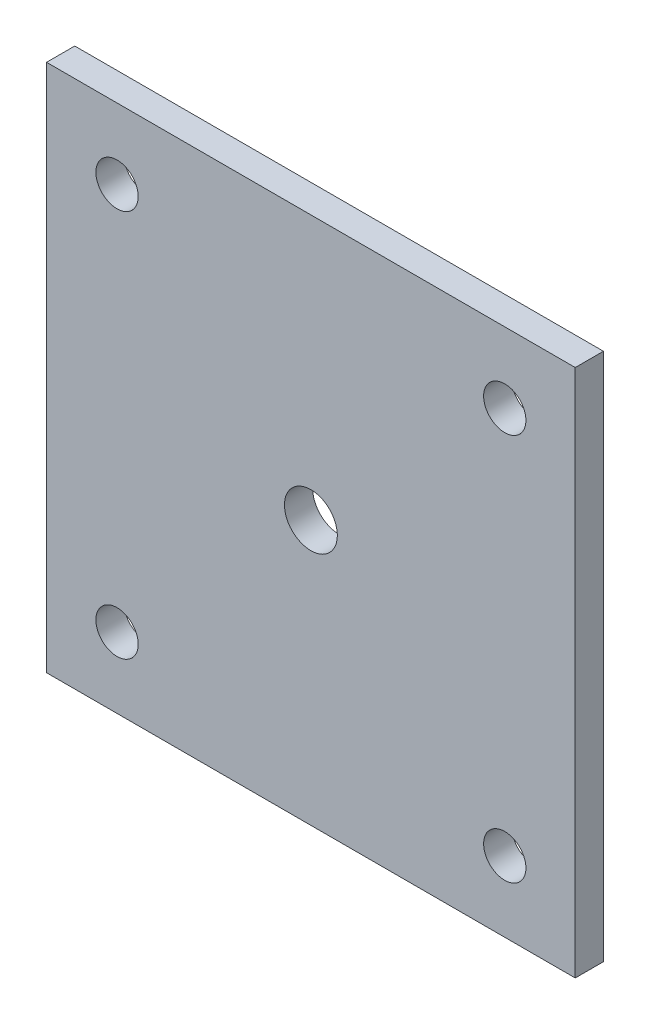
ISO-10303-21;
HEADER;
FILE_DESCRIPTION(('STEP AP214'),'2;1');
FILE_NAME('part.step','',(''),(''),'','','');
FILE_SCHEMA(('AUTOMOTIVE_DESIGN { 1 0 10303 214 1 1 1 1 }'));
ENDSEC;
DATA;
#1=APPLICATION_CONTEXT('core data for automotive mechanical design processes');
#2=APPLICATION_PROTOCOL_DEFINITION('international standard','automotive_design',2000,#1);
#3=PRODUCT_CONTEXT('',#1,'mechanical');
#4=PRODUCT('Part','Part','',(#3));
#5=PRODUCT_RELATED_PRODUCT_CATEGORY('part','',(#4));
#6=PRODUCT_DEFINITION_FORMATION('','',#4);
#7=PRODUCT_DEFINITION_CONTEXT('part definition',#1,'design');
#8=PRODUCT_DEFINITION('design','',#6,#7);
#9=PRODUCT_DEFINITION_SHAPE('','',#8);
#10=(LENGTH_UNIT() NAMED_UNIT(*) SI_UNIT(.MILLI.,.METRE.));
#11=(NAMED_UNIT(*) PLANE_ANGLE_UNIT() SI_UNIT($,.RADIAN.));
#12=(NAMED_UNIT(*) SI_UNIT($,.STERADIAN.) SOLID_ANGLE_UNIT());
#13=UNCERTAINTY_MEASURE_WITH_UNIT(LENGTH_MEASURE(1.E-05),#10,'distance_accuracy_value','');
#14=(GEOMETRIC_REPRESENTATION_CONTEXT(3) GLOBAL_UNCERTAINTY_ASSIGNED_CONTEXT((#13)) GLOBAL_UNIT_ASSIGNED_CONTEXT((#10,
#11,#12)) REPRESENTATION_CONTEXT('',''));
#15=CARTESIAN_POINT('',(0.,0.,0.));
#16=DIRECTION('',(0.,0.,1.));
#17=DIRECTION('',(1.,0.,0.));
#18=AXIS2_PLACEMENT_3D('',#15,#16,#17);
#19=CARTESIAN_POINT('',(75.,75.,8.));
#20=DIRECTION('',(0.,-1.,0.));
#21=DIRECTION('',(0.,0.,-1.));
#22=AXIS2_PLACEMENT_3D('',#19,#20,#21);
#23=PLANE('',#22);
#24=DIRECTION('',(-1.,0.,0.));
#25=VECTOR('',#24,1.);
#26=CARTESIAN_POINT('',(75.,75.,0.));
#27=LINE('',#26,#25);
#28=CARTESIAN_POINT('',(75.,75.,0.));
#29=VERTEX_POINT('',#28);
#30=CARTESIAN_POINT('',(-75.,75.,0.));
#31=VERTEX_POINT('',#30);
#32=EDGE_CURVE('E105',#29,#31,#27,.T.);
#33=ORIENTED_EDGE('',*,*,#32,.T.);
#34=DIRECTION('',(0.,0.,-1.));
#35=VECTOR('',#34,1.);
#36=CARTESIAN_POINT('',(-75.,75.,8.));
#37=LINE('',#36,#35);
#38=CARTESIAN_POINT('',(-75.,75.,8.));
#39=VERTEX_POINT('',#38);
#40=EDGE_CURVE('E11',#39,#31,#37,.T.);
#41=ORIENTED_EDGE('',*,*,#40,.F.);
#42=DIRECTION('',(-1.,0.,0.));
#43=VECTOR('',#42,1.);
#44=CARTESIAN_POINT('',(75.,75.,8.));
#45=LINE('',#44,#43);
#46=CARTESIAN_POINT('',(75.,75.,8.));
#47=VERTEX_POINT('',#46);
#48=EDGE_CURVE('E89',#47,#39,#45,.T.);
#49=ORIENTED_EDGE('',*,*,#48,.F.);
#50=DIRECTION('',(0.,0.,-1.));
#51=VECTOR('',#50,1.);
#52=CARTESIAN_POINT('',(75.,75.,8.));
#53=LINE('',#52,#51);
#54=EDGE_CURVE('E98',#47,#29,#53,.T.);
#55=ORIENTED_EDGE('',*,*,#54,.T.);
#56=EDGE_LOOP('',(#33,#41,#49,#55));
#57=FACE_BOUND('',#56,.T.);
#58=ADVANCED_FACE('F39',(#57),#23,.F.);
#59=CARTESIAN_POINT('',(-75.,-75.,8.));
#60=DIRECTION('',(1.,0.,0.));
#61=DIRECTION('',(0.,0.,-1.));
#62=AXIS2_PLACEMENT_3D('',#59,#60,#61);
#63=PLANE('',#62);
#64=DIRECTION('',(0.,-1.,0.));
#65=VECTOR('',#64,1.);
#66=CARTESIAN_POINT('',(-75.,-75.,0.));
#67=LINE('',#66,#65);
#68=CARTESIAN_POINT('',(-75.,-75.,0.));
#69=VERTEX_POINT('',#68);
#70=EDGE_CURVE('E94',#31,#69,#67,.T.);
#71=ORIENTED_EDGE('',*,*,#70,.T.);
#72=DIRECTION('',(0.,0.,-1.));
#73=VECTOR('',#72,1.);
#74=CARTESIAN_POINT('',(-75.,-75.,8.));
#75=LINE('',#74,#73);
#76=CARTESIAN_POINT('',(-75.,-75.,8.));
#77=VERTEX_POINT('',#76);
#78=EDGE_CURVE('E50',#77,#69,#75,.T.);
#79=ORIENTED_EDGE('',*,*,#78,.F.);
#80=DIRECTION('',(0.,-1.,0.));
#81=VECTOR('',#80,1.);
#82=CARTESIAN_POINT('',(-75.,-75.,8.));
#83=LINE('',#82,#81);
#84=EDGE_CURVE('E81',#39,#77,#83,.T.);
#85=ORIENTED_EDGE('',*,*,#84,.F.);
#86=ORIENTED_EDGE('',*,*,#40,.T.);
#87=EDGE_LOOP('',(#71,#79,#85,#86));
#88=FACE_BOUND('',#87,.T.);
#89=ADVANCED_FACE('F91',(#88),#63,.F.);
#90=CARTESIAN_POINT('',(75.,-75.,8.));
#91=DIRECTION('',(0.,1.,0.));
#92=DIRECTION('',(0.,0.,1.));
#93=AXIS2_PLACEMENT_3D('',#90,#91,#92);
#94=PLANE('',#93);
#95=DIRECTION('',(1.,0.,0.));
#96=VECTOR('',#95,1.);
#97=CARTESIAN_POINT('',(75.,-75.,0.));
#98=LINE('',#97,#96);
#99=CARTESIAN_POINT('',(75.,-75.,0.));
#100=VERTEX_POINT('',#99);
#101=EDGE_CURVE('E75',#69,#100,#98,.T.);
#102=ORIENTED_EDGE('',*,*,#101,.T.);
#103=DIRECTION('',(0.,0.,-1.));
#104=VECTOR('',#103,1.);
#105=CARTESIAN_POINT('',(75.,-75.,8.));
#106=LINE('',#105,#104);
#107=CARTESIAN_POINT('',(75.,-75.,8.));
#108=VERTEX_POINT('',#107);
#109=EDGE_CURVE('E92',#108,#100,#106,.T.);
#110=ORIENTED_EDGE('',*,*,#109,.F.);
#111=DIRECTION('',(1.,0.,0.));
#112=VECTOR('',#111,1.);
#113=CARTESIAN_POINT('',(75.,-75.,8.));
#114=LINE('',#113,#112);
#115=EDGE_CURVE('E86',#77,#108,#114,.T.);
#116=ORIENTED_EDGE('',*,*,#115,.F.);
#117=ORIENTED_EDGE('',*,*,#78,.T.);
#118=EDGE_LOOP('',(#102,#110,#116,#117));
#119=FACE_BOUND('',#118,.T.);
#120=ADVANCED_FACE('F96',(#119),#94,.F.);
#121=CARTESIAN_POINT('',(75.,-75.,8.));
#122=DIRECTION('',(-1.,0.,0.));
#123=DIRECTION('',(0.,0.,1.));
#124=AXIS2_PLACEMENT_3D('',#121,#122,#123);
#125=PLANE('',#124);
#126=DIRECTION('',(0.,1.,0.));
#127=VECTOR('',#126,1.);
#128=CARTESIAN_POINT('',(75.,-75.,0.));
#129=LINE('',#128,#127);
#130=EDGE_CURVE('E79',#100,#29,#129,.T.);
#131=ORIENTED_EDGE('',*,*,#130,.T.);
#132=ORIENTED_EDGE('',*,*,#54,.F.);
#133=DIRECTION('',(0.,1.,0.));
#134=VECTOR('',#133,1.);
#135=CARTESIAN_POINT('',(75.,-75.,8.));
#136=LINE('',#135,#134);
#137=EDGE_CURVE('E54',#108,#47,#136,.T.);
#138=ORIENTED_EDGE('',*,*,#137,.F.);
#139=ORIENTED_EDGE('',*,*,#109,.T.);
#140=EDGE_LOOP('',(#131,#132,#138,#139));
#141=FACE_BOUND('',#140,.T.);
#142=ADVANCED_FACE('F109',(#141),#125,.F.);
#143=CARTESIAN_POINT('',(0.,0.,8.));
#144=DIRECTION('',(0.,0.,-1.));
#145=DIRECTION('',(-1.,0.,0.));
#146=AXIS2_PLACEMENT_3D('',#143,#144,#145);
#147=PLANE('',#146);
#148=CARTESIAN_POINT('',(0.,0.,8.));
#149=DIRECTION('',(0.,0.,1.));
#150=DIRECTION('',(1.,0.,0.));
#151=AXIS2_PLACEMENT_3D('',#148,#149,#150);
#152=CIRCLE('',#151,7.5);
#153=CARTESIAN_POINT('',(7.5,0.,8.));
#154=VERTEX_POINT('',#153);
#155=EDGE_CURVE('E140',#154,#154,#152,.T.);
#156=ORIENTED_EDGE('',*,*,#155,.F.);
#157=EDGE_LOOP('',(#156));
#158=FACE_BOUND('',#157,.T.);
#159=CARTESIAN_POINT('',(-55.,55.,8.));
#160=DIRECTION('',(0.,0.,1.));
#161=DIRECTION('',(1.,0.,0.));
#162=AXIS2_PLACEMENT_3D('',#159,#160,#161);
#163=CIRCLE('',#162,6.);
#164=CARTESIAN_POINT('',(-49.,55.,8.));
#165=VERTEX_POINT('',#164);
#166=EDGE_CURVE('E129',#165,#165,#163,.T.);
#167=ORIENTED_EDGE('',*,*,#166,.F.);
#168=EDGE_LOOP('',(#167));
#169=FACE_BOUND('',#168,.T.);
#170=CARTESIAN_POINT('',(55.,-55.,8.));
#171=DIRECTION('',(0.,0.,1.));
#172=DIRECTION('',(1.,0.,0.));
#173=AXIS2_PLACEMENT_3D('',#170,#171,#172);
#174=CIRCLE('',#173,6.);
#175=CARTESIAN_POINT('',(61.,-55.,8.));
#176=VERTEX_POINT('',#175);
#177=EDGE_CURVE('E125',#176,#176,#174,.T.);
#178=ORIENTED_EDGE('',*,*,#177,.F.);
#179=EDGE_LOOP('',(#178));
#180=FACE_BOUND('',#179,.T.);
#181=CARTESIAN_POINT('',(55.,55.,8.));
#182=DIRECTION('',(0.,0.,1.));
#183=DIRECTION('',(1.,0.,0.));
#184=AXIS2_PLACEMENT_3D('',#181,#182,#183);
#185=CIRCLE('',#184,6.);
#186=CARTESIAN_POINT('',(61.,55.,8.));
#187=VERTEX_POINT('',#186);
#188=EDGE_CURVE('E131',#187,#187,#185,.T.);
#189=ORIENTED_EDGE('',*,*,#188,.F.);
#190=EDGE_LOOP('',(#189));
#191=FACE_BOUND('',#190,.T.);
#192=CARTESIAN_POINT('',(-55.,-55.,8.));
#193=DIRECTION('',(0.,0.,1.));
#194=DIRECTION('',(1.,0.,0.));
#195=AXIS2_PLACEMENT_3D('',#192,#193,#194);
#196=CIRCLE('',#195,6.);
#197=CARTESIAN_POINT('',(-49.,-55.,8.));
#198=VERTEX_POINT('',#197);
#199=EDGE_CURVE('E104',#198,#198,#196,.T.);
#200=ORIENTED_EDGE('',*,*,#199,.F.);
#201=EDGE_LOOP('',(#200));
#202=FACE_BOUND('',#201,.T.);
#203=ORIENTED_EDGE('',*,*,#48,.T.);
#204=ORIENTED_EDGE('',*,*,#84,.T.);
#205=ORIENTED_EDGE('',*,*,#115,.T.);
#206=ORIENTED_EDGE('',*,*,#137,.T.);
#207=EDGE_LOOP('',(#203,#204,#205,#206));
#208=FACE_BOUND('',#207,.T.);
#209=ADVANCED_FACE('F88',(#158,#169,#180,#191,#202,#208),#147,.F.);
#210=CARTESIAN_POINT('',(0.,0.,0.));
#211=DIRECTION('',(0.,0.,-1.));
#212=DIRECTION('',(-1.,0.,0.));
#213=AXIS2_PLACEMENT_3D('',#210,#211,#212);
#214=PLANE('',#213);
#215=CARTESIAN_POINT('',(0.,0.,0.));
#216=DIRECTION('',(0.,0.,1.));
#217=DIRECTION('',(1.,0.,0.));
#218=AXIS2_PLACEMENT_3D('',#215,#216,#217);
#219=CIRCLE('',#218,7.5);
#220=CARTESIAN_POINT('',(7.5,0.,0.));
#221=VERTEX_POINT('',#220);
#222=EDGE_CURVE('E136',#221,#221,#219,.T.);
#223=ORIENTED_EDGE('',*,*,#222,.T.);
#224=EDGE_LOOP('',(#223));
#225=FACE_BOUND('',#224,.T.);
#226=CARTESIAN_POINT('',(-55.,55.,0.));
#227=DIRECTION('',(0.,0.,1.));
#228=DIRECTION('',(1.,0.,0.));
#229=AXIS2_PLACEMENT_3D('',#226,#227,#228);
#230=CIRCLE('',#229,6.);
#231=CARTESIAN_POINT('',(-49.,55.,0.));
#232=VERTEX_POINT('',#231);
#233=EDGE_CURVE('E116',#232,#232,#230,.T.);
#234=ORIENTED_EDGE('',*,*,#233,.T.);
#235=EDGE_LOOP('',(#234));
#236=FACE_BOUND('',#235,.T.);
#237=CARTESIAN_POINT('',(55.,-55.,0.));
#238=DIRECTION('',(0.,0.,1.));
#239=DIRECTION('',(1.,0.,0.));
#240=AXIS2_PLACEMENT_3D('',#237,#238,#239);
#241=CIRCLE('',#240,6.);
#242=CARTESIAN_POINT('',(61.,-55.,0.));
#243=VERTEX_POINT('',#242);
#244=EDGE_CURVE('E121',#243,#243,#241,.T.);
#245=ORIENTED_EDGE('',*,*,#244,.T.);
#246=EDGE_LOOP('',(#245));
#247=FACE_BOUND('',#246,.T.);
#248=CARTESIAN_POINT('',(55.,55.,0.));
#249=DIRECTION('',(0.,0.,1.));
#250=DIRECTION('',(1.,0.,0.));
#251=AXIS2_PLACEMENT_3D('',#248,#249,#250);
#252=CIRCLE('',#251,6.);
#253=CARTESIAN_POINT('',(61.,55.,0.));
#254=VERTEX_POINT('',#253);
#255=EDGE_CURVE('E127',#254,#254,#252,.T.);
#256=ORIENTED_EDGE('',*,*,#255,.T.);
#257=EDGE_LOOP('',(#256));
#258=FACE_BOUND('',#257,.T.);
#259=CARTESIAN_POINT('',(-55.,-55.,0.));
#260=DIRECTION('',(0.,0.,1.));
#261=DIRECTION('',(1.,0.,0.));
#262=AXIS2_PLACEMENT_3D('',#259,#260,#261);
#263=CIRCLE('',#262,6.);
#264=CARTESIAN_POINT('',(-49.,-55.,0.));
#265=VERTEX_POINT('',#264);
#266=EDGE_CURVE('E117',#265,#265,#263,.T.);
#267=ORIENTED_EDGE('',*,*,#266,.T.);
#268=EDGE_LOOP('',(#267));
#269=FACE_BOUND('',#268,.T.);
#270=ORIENTED_EDGE('',*,*,#32,.F.);
#271=ORIENTED_EDGE('',*,*,#130,.F.);
#272=ORIENTED_EDGE('',*,*,#101,.F.);
#273=ORIENTED_EDGE('',*,*,#70,.F.);
#274=EDGE_LOOP('',(#270,#271,#272,#273));
#275=FACE_BOUND('',#274,.T.);
#276=ADVANCED_FACE('F114',(#225,#236,#247,#258,#269,#275),#214,.T.);
#277=CARTESIAN_POINT('',(-55.,-55.,8.));
#278=DIRECTION('',(0.,0.,-1.));
#279=DIRECTION('',(-1.,0.,0.));
#280=AXIS2_PLACEMENT_3D('',#277,#278,#279);
#281=CYLINDRICAL_SURFACE('',#280,6.);
#282=ORIENTED_EDGE('',*,*,#199,.T.);
#283=EDGE_LOOP('',(#282));
#284=FACE_BOUND('',#283,.T.);
#285=ORIENTED_EDGE('',*,*,#266,.F.);
#286=EDGE_LOOP('',(#285));
#287=FACE_BOUND('',#286,.T.);
#288=ADVANCED_FACE('F159',(#284,#287),#281,.F.);
#289=CARTESIAN_POINT('',(55.,55.,8.));
#290=DIRECTION('',(0.,0.,-1.));
#291=DIRECTION('',(-1.,0.,0.));
#292=AXIS2_PLACEMENT_3D('',#289,#290,#291);
#293=CYLINDRICAL_SURFACE('',#292,6.);
#294=ORIENTED_EDGE('',*,*,#188,.T.);
#295=EDGE_LOOP('',(#294));
#296=FACE_BOUND('',#295,.T.);
#297=ORIENTED_EDGE('',*,*,#255,.F.);
#298=EDGE_LOOP('',(#297));
#299=FACE_BOUND('',#298,.T.);
#300=ADVANCED_FACE('F162',(#296,#299),#293,.F.);
#301=CARTESIAN_POINT('',(55.,-55.,8.));
#302=DIRECTION('',(0.,0.,-1.));
#303=DIRECTION('',(-1.,0.,0.));
#304=AXIS2_PLACEMENT_3D('',#301,#302,#303);
#305=CYLINDRICAL_SURFACE('',#304,6.);
#306=ORIENTED_EDGE('',*,*,#177,.T.);
#307=EDGE_LOOP('',(#306));
#308=FACE_BOUND('',#307,.T.);
#309=ORIENTED_EDGE('',*,*,#244,.F.);
#310=EDGE_LOOP('',(#309));
#311=FACE_BOUND('',#310,.T.);
#312=ADVANCED_FACE('F203',(#308,#311),#305,.F.);
#313=CARTESIAN_POINT('',(-55.,55.,8.));
#314=DIRECTION('',(0.,0.,-1.));
#315=DIRECTION('',(-1.,0.,0.));
#316=AXIS2_PLACEMENT_3D('',#313,#314,#315);
#317=CYLINDRICAL_SURFACE('',#316,6.);
#318=ORIENTED_EDGE('',*,*,#166,.T.);
#319=EDGE_LOOP('',(#318));
#320=FACE_BOUND('',#319,.T.);
#321=ORIENTED_EDGE('',*,*,#233,.F.);
#322=EDGE_LOOP('',(#321));
#323=FACE_BOUND('',#322,.T.);
#324=ADVANCED_FACE('F209',(#320,#323),#317,.F.);
#325=CARTESIAN_POINT('',(0.,0.,8.));
#326=DIRECTION('',(0.,0.,-1.));
#327=DIRECTION('',(-1.,0.,0.));
#328=AXIS2_PLACEMENT_3D('',#325,#326,#327);
#329=CYLINDRICAL_SURFACE('',#328,7.5);
#330=ORIENTED_EDGE('',*,*,#155,.T.);
#331=EDGE_LOOP('',(#330));
#332=FACE_BOUND('',#331,.T.);
#333=ORIENTED_EDGE('',*,*,#222,.F.);
#334=EDGE_LOOP('',(#333));
#335=FACE_BOUND('',#334,.T.);
#336=ADVANCED_FACE('F148',(#332,#335),#329,.F.);
#337=CLOSED_SHELL('',(#58,#89,#120,#142,#209,#276,#288,#300,#312,#324,#336));
#338=MANIFOLD_SOLID_BREP('B2',#337);
#339=ADVANCED_BREP_SHAPE_REPRESENTATION('',(#18,#338),#14);
#340=SHAPE_DEFINITION_REPRESENTATION(#9,#339);
ENDSEC;
END-ISO-10303-21;
